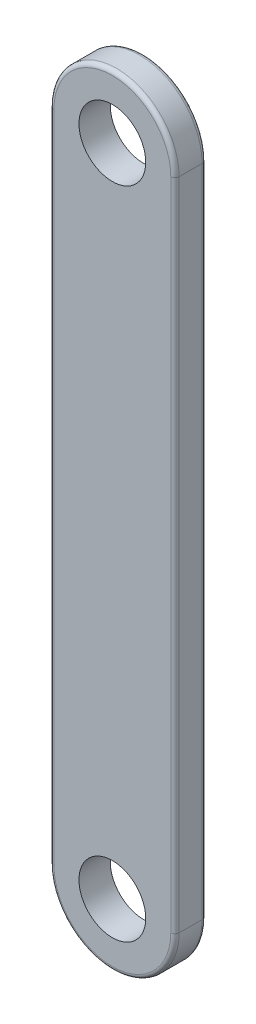
ISO-10303-21;
HEADER;
FILE_DESCRIPTION(('STEP AP214'),'2;1');
FILE_NAME('part.step','',(''),(''),'','','');
FILE_SCHEMA(('AUTOMOTIVE_DESIGN { 1 0 10303 214 1 1 1 1 }'));
ENDSEC;
DATA;
#1=APPLICATION_CONTEXT('core data for automotive mechanical design processes');
#2=APPLICATION_PROTOCOL_DEFINITION('international standard','automotive_design',2000,#1);
#3=PRODUCT_CONTEXT('',#1,'mechanical');
#4=PRODUCT('Part','Part','',(#3));
#5=PRODUCT_RELATED_PRODUCT_CATEGORY('part','',(#4));
#6=PRODUCT_DEFINITION_FORMATION('','',#4);
#7=PRODUCT_DEFINITION_CONTEXT('part definition',#1,'design');
#8=PRODUCT_DEFINITION('design','',#6,#7);
#9=PRODUCT_DEFINITION_SHAPE('','',#8);
#10=(LENGTH_UNIT() NAMED_UNIT(*) SI_UNIT(.MILLI.,.METRE.));
#11=(NAMED_UNIT(*) PLANE_ANGLE_UNIT() SI_UNIT($,.RADIAN.));
#12=(NAMED_UNIT(*) SI_UNIT($,.STERADIAN.) SOLID_ANGLE_UNIT());
#13=UNCERTAINTY_MEASURE_WITH_UNIT(LENGTH_MEASURE(1.E-05),#10,'distance_accuracy_value','');
#14=(GEOMETRIC_REPRESENTATION_CONTEXT(3) GLOBAL_UNCERTAINTY_ASSIGNED_CONTEXT((#13)) GLOBAL_UNIT_ASSIGNED_CONTEXT((#10,
#11,#12)) REPRESENTATION_CONTEXT('',''));
#15=CARTESIAN_POINT('',(0.,0.,0.));
#16=DIRECTION('',(0.,0.,1.));
#17=DIRECTION('',(1.,0.,0.));
#18=AXIS2_PLACEMENT_3D('',#15,#16,#17);
#19=CARTESIAN_POINT('',(0.,0.,1.5));
#20=DIRECTION('',(0.,0.,1.));
#21=DIRECTION('',(1.,0.,0.));
#22=AXIS2_PLACEMENT_3D('',#19,#20,#21);
#23=PLANE('',#22);
#24=DIRECTION('',(0.,-1.,0.));
#25=VECTOR('',#24,1.);
#26=CARTESIAN_POINT('',(-2.8,-31.38,1.5));
#27=LINE('',#26,#25);
#28=CARTESIAN_POINT('',(-2.8,0.,1.5));
#29=VERTEX_POINT('',#28);
#30=CARTESIAN_POINT('',(-2.8,-31.38,1.5));
#31=VERTEX_POINT('',#30);
#32=EDGE_CURVE('E124',#29,#31,#27,.T.);
#33=ORIENTED_EDGE('',*,*,#32,.T.);
#34=CARTESIAN_POINT('',(0.,-31.38,1.5));
#35=DIRECTION('',(0.,0.,1.));
#36=DIRECTION('',(1.,0.,0.));
#37=AXIS2_PLACEMENT_3D('',#34,#35,#36);
#38=CIRCLE('',#37,2.8);
#39=CARTESIAN_POINT('',(2.8,-31.38,1.5));
#40=VERTEX_POINT('',#39);
#41=EDGE_CURVE('E105',#31,#40,#38,.T.);
#42=ORIENTED_EDGE('',*,*,#41,.T.);
#43=DIRECTION('',(0.,1.,0.));
#44=VECTOR('',#43,1.);
#45=CARTESIAN_POINT('',(2.8,0.,1.5));
#46=LINE('',#45,#44);
#47=CARTESIAN_POINT('',(2.8,0.,1.5));
#48=VERTEX_POINT('',#47);
#49=EDGE_CURVE('E113',#40,#48,#46,.T.);
#50=ORIENTED_EDGE('',*,*,#49,.T.);
#51=CARTESIAN_POINT('',(0.,0.,1.5));
#52=DIRECTION('',(0.,0.,1.));
#53=DIRECTION('',(1.,0.,0.));
#54=AXIS2_PLACEMENT_3D('',#51,#52,#53);
#55=CIRCLE('',#54,2.8);
#56=EDGE_CURVE('E119',#48,#29,#55,.T.);
#57=ORIENTED_EDGE('',*,*,#56,.T.);
#58=EDGE_LOOP('',(#33,#42,#50,#57));
#59=FACE_BOUND('',#58,.T.);
#60=CARTESIAN_POINT('',(0.,0.,1.5));
#61=DIRECTION('',(0.,0.,1.));
#62=DIRECTION('',(1.,0.,0.));
#63=AXIS2_PLACEMENT_3D('',#60,#61,#62);
#64=CIRCLE('',#63,1.6);
#65=CARTESIAN_POINT('',(1.6,0.,1.5));
#66=VERTEX_POINT('',#65);
#67=EDGE_CURVE('E191',#66,#66,#64,.T.);
#68=ORIENTED_EDGE('',*,*,#67,.F.);
#69=EDGE_LOOP('',(#68));
#70=FACE_BOUND('',#69,.T.);
#71=CARTESIAN_POINT('',(0.,-31.38,1.5));
#72=DIRECTION('',(0.,0.,1.));
#73=DIRECTION('',(1.,0.,0.));
#74=AXIS2_PLACEMENT_3D('',#71,#72,#73);
#75=CIRCLE('',#74,1.6);
#76=CARTESIAN_POINT('',(1.6,-31.38,1.5));
#77=VERTEX_POINT('',#76);
#78=EDGE_CURVE('E341',#77,#77,#75,.T.);
#79=ORIENTED_EDGE('',*,*,#78,.F.);
#80=EDGE_LOOP('',(#79));
#81=FACE_BOUND('',#80,.T.);
#82=ADVANCED_FACE('F32',(#59,#70,#81),#23,.T.);
#83=CARTESIAN_POINT('',(0.,0.,0.));
#84=DIRECTION('',(0.,0.,1.));
#85=DIRECTION('',(1.,0.,0.));
#86=AXIS2_PLACEMENT_3D('',#83,#84,#85);
#87=PLANE('',#86);
#88=DIRECTION('',(0.,1.,0.));
#89=VECTOR('',#88,1.);
#90=CARTESIAN_POINT('',(2.8,0.,0.));
#91=LINE('',#90,#89);
#92=CARTESIAN_POINT('',(2.8,0.,0.));
#93=VERTEX_POINT('',#92);
#94=CARTESIAN_POINT('',(2.8,-31.38,0.));
#95=VERTEX_POINT('',#94);
#96=EDGE_CURVE('E142',#93,#95,#91,.F.);
#97=ORIENTED_EDGE('',*,*,#96,.T.);
#98=CARTESIAN_POINT('',(0.,-31.38,0.));
#99=DIRECTION('',(0.,0.,1.));
#100=DIRECTION('',(1.,0.,0.));
#101=AXIS2_PLACEMENT_3D('',#98,#99,#100);
#102=CIRCLE('',#101,2.8);
#103=CARTESIAN_POINT('',(-2.8,-31.38,0.));
#104=VERTEX_POINT('',#103);
#105=EDGE_CURVE('E147',#95,#104,#102,.F.);
#106=ORIENTED_EDGE('',*,*,#105,.T.);
#107=DIRECTION('',(0.,-1.,0.));
#108=VECTOR('',#107,1.);
#109=CARTESIAN_POINT('',(-2.8,0.,0.));
#110=LINE('',#109,#108);
#111=CARTESIAN_POINT('',(-2.8,0.,0.));
#112=VERTEX_POINT('',#111);
#113=EDGE_CURVE('E56',#104,#112,#110,.F.);
#114=ORIENTED_EDGE('',*,*,#113,.T.);
#115=CARTESIAN_POINT('',(0.,0.,0.));
#116=DIRECTION('',(0.,0.,1.));
#117=DIRECTION('',(1.,0.,0.));
#118=AXIS2_PLACEMENT_3D('',#115,#116,#117);
#119=CIRCLE('',#118,2.8);
#120=EDGE_CURVE('E144',#112,#93,#119,.F.);
#121=ORIENTED_EDGE('',*,*,#120,.T.);
#122=EDGE_LOOP('',(#97,#106,#114,#121));
#123=FACE_BOUND('',#122,.T.);
#124=CARTESIAN_POINT('',(0.,0.,0.));
#125=DIRECTION('',(0.,0.,1.));
#126=DIRECTION('',(1.,0.,0.));
#127=AXIS2_PLACEMENT_3D('',#124,#125,#126);
#128=CIRCLE('',#127,1.6);
#129=CARTESIAN_POINT('',(1.6,0.,0.));
#130=VERTEX_POINT('',#129);
#131=EDGE_CURVE('E346',#130,#130,#128,.T.);
#132=ORIENTED_EDGE('',*,*,#131,.T.);
#133=EDGE_LOOP('',(#132));
#134=FACE_BOUND('',#133,.T.);
#135=CARTESIAN_POINT('',(0.,-31.38,0.));
#136=DIRECTION('',(0.,0.,1.));
#137=DIRECTION('',(1.,0.,0.));
#138=AXIS2_PLACEMENT_3D('',#135,#136,#137);
#139=CIRCLE('',#138,1.6);
#140=CARTESIAN_POINT('',(1.6,-31.38,0.));
#141=VERTEX_POINT('',#140);
#142=EDGE_CURVE('E155',#141,#141,#139,.T.);
#143=ORIENTED_EDGE('',*,*,#142,.T.);
#144=EDGE_LOOP('',(#143));
#145=FACE_BOUND('',#144,.T.);
#146=ADVANCED_FACE('F171',(#123,#134,#145),#87,.F.);
#147=CARTESIAN_POINT('',(0.,0.,1.5));
#148=DIRECTION('',(0.,0.,-1.));
#149=DIRECTION('',(-1.,0.,0.));
#150=AXIS2_PLACEMENT_3D('',#147,#148,#149);
#151=CYLINDRICAL_SURFACE('',#150,3.);
#152=DIRECTION('',(0.,0.,-1.));
#153=VECTOR('',#152,1.);
#154=CARTESIAN_POINT('',(-3.,0.,1.5));
#155=LINE('',#154,#153);
#156=CARTESIAN_POINT('',(-3.,0.,1.3));
#157=VERTEX_POINT('',#156);
#158=CARTESIAN_POINT('',(-3.,0.,0.2));
#159=VERTEX_POINT('',#158);
#160=EDGE_CURVE('E120',#157,#159,#155,.T.);
#161=ORIENTED_EDGE('',*,*,#160,.F.);
#162=CARTESIAN_POINT('',(0.,0.,1.3));
#163=DIRECTION('',(0.,0.,1.));
#164=DIRECTION('',(1.,0.,0.));
#165=AXIS2_PLACEMENT_3D('',#162,#163,#164);
#166=CIRCLE('',#165,3.);
#167=CARTESIAN_POINT('',(3.,0.,1.3));
#168=VERTEX_POINT('',#167);
#169=EDGE_CURVE('E140',#157,#168,#166,.F.);
#170=ORIENTED_EDGE('',*,*,#169,.T.);
#171=DIRECTION('',(0.,0.,-1.));
#172=VECTOR('',#171,1.);
#173=CARTESIAN_POINT('',(3.,0.,1.5));
#174=LINE('',#173,#172);
#175=CARTESIAN_POINT('',(3.,0.,0.2));
#176=VERTEX_POINT('',#175);
#177=EDGE_CURVE('E188',#168,#176,#174,.T.);
#178=ORIENTED_EDGE('',*,*,#177,.T.);
#179=CARTESIAN_POINT('',(0.,0.,0.2));
#180=DIRECTION('',(0.,0.,1.));
#181=DIRECTION('',(1.,0.,0.));
#182=AXIS2_PLACEMENT_3D('',#179,#180,#181);
#183=CIRCLE('',#182,3.);
#184=EDGE_CURVE('E138',#176,#159,#183,.T.);
#185=ORIENTED_EDGE('',*,*,#184,.T.);
#186=EDGE_LOOP('',(#161,#170,#178,#185));
#187=FACE_BOUND('',#186,.T.);
#188=ADVANCED_FACE('F207',(#187),#151,.T.);
#189=CARTESIAN_POINT('',(-3.,0.,1.5));
#190=DIRECTION('',(1.,0.,0.));
#191=DIRECTION('',(0.,1.,0.));
#192=AXIS2_PLACEMENT_3D('',#189,#190,#191);
#193=PLANE('',#192);
#194=DIRECTION('',(0.,0.,-1.));
#195=VECTOR('',#194,1.);
#196=CARTESIAN_POINT('',(-3.,-31.38,1.5));
#197=LINE('',#196,#195);
#198=CARTESIAN_POINT('',(-3.,-31.38,1.3));
#199=VERTEX_POINT('',#198);
#200=CARTESIAN_POINT('',(-3.,-31.38,0.2));
#201=VERTEX_POINT('',#200);
#202=EDGE_CURVE('E186',#199,#201,#197,.T.);
#203=ORIENTED_EDGE('',*,*,#202,.F.);
#204=DIRECTION('',(0.,-1.,0.));
#205=VECTOR('',#204,1.);
#206=CARTESIAN_POINT('',(-3.,0.,1.3));
#207=LINE('',#206,#205);
#208=EDGE_CURVE('E136',#199,#157,#207,.F.);
#209=ORIENTED_EDGE('',*,*,#208,.T.);
#210=ORIENTED_EDGE('',*,*,#160,.T.);
#211=DIRECTION('',(0.,-1.,0.));
#212=VECTOR('',#211,1.);
#213=CARTESIAN_POINT('',(-3.,0.,0.2));
#214=LINE('',#213,#212);
#215=EDGE_CURVE('E134',#159,#201,#214,.T.);
#216=ORIENTED_EDGE('',*,*,#215,.T.);
#217=EDGE_LOOP('',(#203,#209,#210,#216));
#218=FACE_BOUND('',#217,.T.);
#219=ADVANCED_FACE('F205',(#218),#193,.F.);
#220=CARTESIAN_POINT('',(0.,-31.38,1.5));
#221=DIRECTION('',(0.,0.,-1.));
#222=DIRECTION('',(-1.,0.,0.));
#223=AXIS2_PLACEMENT_3D('',#220,#221,#222);
#224=CYLINDRICAL_SURFACE('',#223,3.);
#225=DIRECTION('',(0.,0.,-1.));
#226=VECTOR('',#225,1.);
#227=CARTESIAN_POINT('',(3.,-31.38,1.5));
#228=LINE('',#227,#226);
#229=CARTESIAN_POINT('',(3.,-31.38,1.3));
#230=VERTEX_POINT('',#229);
#231=CARTESIAN_POINT('',(3.,-31.38,0.2));
#232=VERTEX_POINT('',#231);
#233=EDGE_CURVE('E184',#230,#232,#228,.T.);
#234=ORIENTED_EDGE('',*,*,#233,.F.);
#235=CARTESIAN_POINT('',(0.,-31.38,1.3));
#236=DIRECTION('',(0.,0.,1.));
#237=DIRECTION('',(1.,0.,0.));
#238=AXIS2_PLACEMENT_3D('',#235,#236,#237);
#239=CIRCLE('',#238,3.);
#240=EDGE_CURVE('E107',#230,#199,#239,.F.);
#241=ORIENTED_EDGE('',*,*,#240,.T.);
#242=ORIENTED_EDGE('',*,*,#202,.T.);
#243=CARTESIAN_POINT('',(0.,-31.38,0.2));
#244=DIRECTION('',(0.,0.,1.));
#245=DIRECTION('',(1.,0.,0.));
#246=AXIS2_PLACEMENT_3D('',#243,#244,#245);
#247=CIRCLE('',#246,3.);
#248=EDGE_CURVE('E126',#201,#232,#247,.T.);
#249=ORIENTED_EDGE('',*,*,#248,.T.);
#250=EDGE_LOOP('',(#234,#241,#242,#249));
#251=FACE_BOUND('',#250,.T.);
#252=ADVANCED_FACE('F183',(#251),#224,.T.);
#253=CARTESIAN_POINT('',(3.,0.,1.5));
#254=DIRECTION('',(-1.,0.,0.));
#255=DIRECTION('',(0.,-1.,0.));
#256=AXIS2_PLACEMENT_3D('',#253,#254,#255);
#257=PLANE('',#256);
#258=ORIENTED_EDGE('',*,*,#177,.F.);
#259=DIRECTION('',(0.,1.,0.));
#260=VECTOR('',#259,1.);
#261=CARTESIAN_POINT('',(3.,-31.38,1.3));
#262=LINE('',#261,#260);
#263=EDGE_CURVE('E11',#168,#230,#262,.F.);
#264=ORIENTED_EDGE('',*,*,#263,.T.);
#265=ORIENTED_EDGE('',*,*,#233,.T.);
#266=DIRECTION('',(0.,1.,0.));
#267=VECTOR('',#266,1.);
#268=CARTESIAN_POINT('',(3.,0.,0.2));
#269=LINE('',#268,#267);
#270=EDGE_CURVE('E41',#232,#176,#269,.T.);
#271=ORIENTED_EDGE('',*,*,#270,.T.);
#272=EDGE_LOOP('',(#258,#264,#265,#271));
#273=FACE_BOUND('',#272,.T.);
#274=ADVANCED_FACE('F187',(#273),#257,.F.);
#275=CARTESIAN_POINT('',(0.,0.,1.5));
#276=DIRECTION('',(0.,0.,-1.));
#277=DIRECTION('',(-1.,0.,0.));
#278=AXIS2_PLACEMENT_3D('',#275,#276,#277);
#279=CYLINDRICAL_SURFACE('',#278,1.6);
#280=ORIENTED_EDGE('',*,*,#67,.T.);
#281=EDGE_LOOP('',(#280));
#282=FACE_BOUND('',#281,.T.);
#283=ORIENTED_EDGE('',*,*,#131,.F.);
#284=EDGE_LOOP('',(#283));
#285=FACE_BOUND('',#284,.T.);
#286=ADVANCED_FACE('F222',(#282,#285),#279,.F.);
#287=CARTESIAN_POINT('',(0.,-31.38,1.5));
#288=DIRECTION('',(0.,0.,-1.));
#289=DIRECTION('',(-1.,0.,0.));
#290=AXIS2_PLACEMENT_3D('',#287,#288,#289);
#291=CYLINDRICAL_SURFACE('',#290,1.6);
#292=ORIENTED_EDGE('',*,*,#78,.T.);
#293=EDGE_LOOP('',(#292));
#294=FACE_BOUND('',#293,.T.);
#295=ORIENTED_EDGE('',*,*,#142,.F.);
#296=EDGE_LOOP('',(#295));
#297=FACE_BOUND('',#296,.T.);
#298=ADVANCED_FACE('F243',(#294,#297),#291,.F.);
#299=CARTESIAN_POINT('',(0.,0.,1.3));
#300=DIRECTION('',(0.,0.,1.));
#301=DIRECTION('',(1.,0.,0.));
#302=AXIS2_PLACEMENT_3D('',#299,#300,#301);
#303=TOROIDAL_SURFACE('',#302,2.8,0.2);
#304=CARTESIAN_POINT('',(2.8,0.,1.3));
#305=DIRECTION('',(0.,-1.,0.));
#306=DIRECTION('',(0.,0.,-1.));
#307=AXIS2_PLACEMENT_3D('',#304,#305,#306);
#308=CIRCLE('',#307,0.2);
#309=EDGE_CURVE('E116',#168,#48,#308,.T.);
#310=ORIENTED_EDGE('',*,*,#309,.F.);
#311=ORIENTED_EDGE('',*,*,#169,.F.);
#312=CARTESIAN_POINT('',(-2.8,0.,1.3));
#313=DIRECTION('',(0.,-1.,0.));
#314=DIRECTION('',(1.,0.,0.));
#315=AXIS2_PLACEMENT_3D('',#312,#313,#314);
#316=CIRCLE('',#315,0.2);
#317=EDGE_CURVE('E152',#29,#157,#316,.T.);
#318=ORIENTED_EDGE('',*,*,#317,.F.);
#319=ORIENTED_EDGE('',*,*,#56,.F.);
#320=EDGE_LOOP('',(#310,#311,#318,#319));
#321=FACE_BOUND('',#320,.T.);
#322=ADVANCED_FACE('F199',(#321),#303,.T.);
#323=CARTESIAN_POINT('',(-2.8,0.,1.3));
#324=DIRECTION('',(0.,1.,0.));
#325=DIRECTION('',(-1.,0.,0.));
#326=AXIS2_PLACEMENT_3D('',#323,#324,#325);
#327=CYLINDRICAL_SURFACE('',#326,0.2);
#328=ORIENTED_EDGE('',*,*,#317,.T.);
#329=ORIENTED_EDGE('',*,*,#208,.F.);
#330=CARTESIAN_POINT('',(-2.8,-31.38,1.3));
#331=DIRECTION('',(0.,-1.,0.));
#332=DIRECTION('',(0.,0.,-1.));
#333=AXIS2_PLACEMENT_3D('',#330,#331,#332);
#334=CIRCLE('',#333,0.2);
#335=EDGE_CURVE('E110',#31,#199,#334,.T.);
#336=ORIENTED_EDGE('',*,*,#335,.F.);
#337=ORIENTED_EDGE('',*,*,#32,.F.);
#338=EDGE_LOOP('',(#328,#329,#336,#337));
#339=FACE_BOUND('',#338,.T.);
#340=ADVANCED_FACE('F202',(#339),#327,.T.);
#341=CARTESIAN_POINT('',(2.8,0.,1.3));
#342=DIRECTION('',(0.,-1.,0.));
#343=DIRECTION('',(1.,0.,0.));
#344=AXIS2_PLACEMENT_3D('',#341,#342,#343);
#345=CYLINDRICAL_SURFACE('',#344,0.2);
#346=ORIENTED_EDGE('',*,*,#309,.T.);
#347=ORIENTED_EDGE('',*,*,#49,.F.);
#348=CARTESIAN_POINT('',(2.8,-31.38,1.3));
#349=DIRECTION('',(0.,-1.,0.));
#350=DIRECTION('',(0.,0.,-1.));
#351=AXIS2_PLACEMENT_3D('',#348,#349,#350);
#352=CIRCLE('',#351,0.2);
#353=EDGE_CURVE('E101',#230,#40,#352,.T.);
#354=ORIENTED_EDGE('',*,*,#353,.F.);
#355=ORIENTED_EDGE('',*,*,#263,.F.);
#356=EDGE_LOOP('',(#346,#347,#354,#355));
#357=FACE_BOUND('',#356,.T.);
#358=ADVANCED_FACE('F114',(#357),#345,.T.);
#359=CARTESIAN_POINT('',(0.,-31.38,1.3));
#360=DIRECTION('',(0.,0.,1.));
#361=DIRECTION('',(1.,0.,0.));
#362=AXIS2_PLACEMENT_3D('',#359,#360,#361);
#363=TOROIDAL_SURFACE('',#362,2.8,0.2);
#364=ORIENTED_EDGE('',*,*,#335,.T.);
#365=ORIENTED_EDGE('',*,*,#240,.F.);
#366=ORIENTED_EDGE('',*,*,#353,.T.);
#367=ORIENTED_EDGE('',*,*,#41,.F.);
#368=EDGE_LOOP('',(#364,#365,#366,#367));
#369=FACE_BOUND('',#368,.T.);
#370=ADVANCED_FACE('F103',(#369),#363,.T.);
#371=CARTESIAN_POINT('',(0.,0.,0.2));
#372=DIRECTION('',(0.,0.,1.));
#373=DIRECTION('',(1.,0.,0.));
#374=AXIS2_PLACEMENT_3D('',#371,#372,#373);
#375=TOROIDAL_SURFACE('',#374,2.8,0.2);
#376=CARTESIAN_POINT('',(2.8,0.,0.2));
#377=DIRECTION('',(0.,-1.,0.));
#378=DIRECTION('',(0.,0.,-1.));
#379=AXIS2_PLACEMENT_3D('',#376,#377,#378);
#380=CIRCLE('',#379,0.2);
#381=EDGE_CURVE('E158',#93,#176,#380,.T.);
#382=ORIENTED_EDGE('',*,*,#381,.F.);
#383=ORIENTED_EDGE('',*,*,#120,.F.);
#384=CARTESIAN_POINT('',(-2.8,0.,0.2));
#385=DIRECTION('',(0.,-1.,0.));
#386=DIRECTION('',(0.,0.,-1.));
#387=AXIS2_PLACEMENT_3D('',#384,#385,#386);
#388=CIRCLE('',#387,0.2);
#389=EDGE_CURVE('E36',#159,#112,#388,.T.);
#390=ORIENTED_EDGE('',*,*,#389,.F.);
#391=ORIENTED_EDGE('',*,*,#184,.F.);
#392=EDGE_LOOP('',(#382,#383,#390,#391));
#393=FACE_BOUND('',#392,.T.);
#394=ADVANCED_FACE('F34',(#393),#375,.T.);
#395=CARTESIAN_POINT('',(-2.8,0.,0.2));
#396=DIRECTION('',(0.,-1.,0.));
#397=DIRECTION('',(1.,0.,0.));
#398=AXIS2_PLACEMENT_3D('',#395,#396,#397);
#399=CYLINDRICAL_SURFACE('',#398,0.2);
#400=ORIENTED_EDGE('',*,*,#389,.T.);
#401=ORIENTED_EDGE('',*,*,#113,.F.);
#402=CARTESIAN_POINT('',(-2.8,-31.38,0.2));
#403=DIRECTION('',(0.,-1.,0.));
#404=DIRECTION('',(0.,0.,-1.));
#405=AXIS2_PLACEMENT_3D('',#402,#403,#404);
#406=CIRCLE('',#405,0.2);
#407=EDGE_CURVE('E49',#201,#104,#406,.T.);
#408=ORIENTED_EDGE('',*,*,#407,.F.);
#409=ORIENTED_EDGE('',*,*,#215,.F.);
#410=EDGE_LOOP('',(#400,#401,#408,#409));
#411=FACE_BOUND('',#410,.T.);
#412=ADVANCED_FACE('F168',(#411),#399,.T.);
#413=CARTESIAN_POINT('',(2.8,0.,0.2));
#414=DIRECTION('',(0.,1.,0.));
#415=DIRECTION('',(-1.,0.,0.));
#416=AXIS2_PLACEMENT_3D('',#413,#414,#415);
#417=CYLINDRICAL_SURFACE('',#416,0.2);
#418=ORIENTED_EDGE('',*,*,#381,.T.);
#419=ORIENTED_EDGE('',*,*,#270,.F.);
#420=CARTESIAN_POINT('',(2.8,-31.38,0.2));
#421=DIRECTION('',(0.,-1.,0.));
#422=DIRECTION('',(0.,0.,-1.));
#423=AXIS2_PLACEMENT_3D('',#420,#421,#422);
#424=CIRCLE('',#423,0.2);
#425=EDGE_CURVE('E156',#95,#232,#424,.T.);
#426=ORIENTED_EDGE('',*,*,#425,.F.);
#427=ORIENTED_EDGE('',*,*,#96,.F.);
#428=EDGE_LOOP('',(#418,#419,#426,#427));
#429=FACE_BOUND('',#428,.T.);
#430=ADVANCED_FACE('F175',(#429),#417,.T.);
#431=CARTESIAN_POINT('',(0.,-31.38,0.2));
#432=DIRECTION('',(0.,0.,1.));
#433=DIRECTION('',(1.,0.,0.));
#434=AXIS2_PLACEMENT_3D('',#431,#432,#433);
#435=TOROIDAL_SURFACE('',#434,2.8,0.2);
#436=ORIENTED_EDGE('',*,*,#407,.T.);
#437=ORIENTED_EDGE('',*,*,#105,.F.);
#438=ORIENTED_EDGE('',*,*,#425,.T.);
#439=ORIENTED_EDGE('',*,*,#248,.F.);
#440=EDGE_LOOP('',(#436,#437,#438,#439));
#441=FACE_BOUND('',#440,.T.);
#442=ADVANCED_FACE('F174',(#441),#435,.T.);
#443=CLOSED_SHELL('',(#82,#146,#188,#219,#252,#274,#286,#298,#322,#340,#358,#370,#394,#412,#430,#442));
#444=MANIFOLD_SOLID_BREP('B2',#443);
#445=ADVANCED_BREP_SHAPE_REPRESENTATION('',(#18,#444),#14);
#446=SHAPE_DEFINITION_REPRESENTATION(#9,#445);
ENDSEC;
END-ISO-10303-21;
